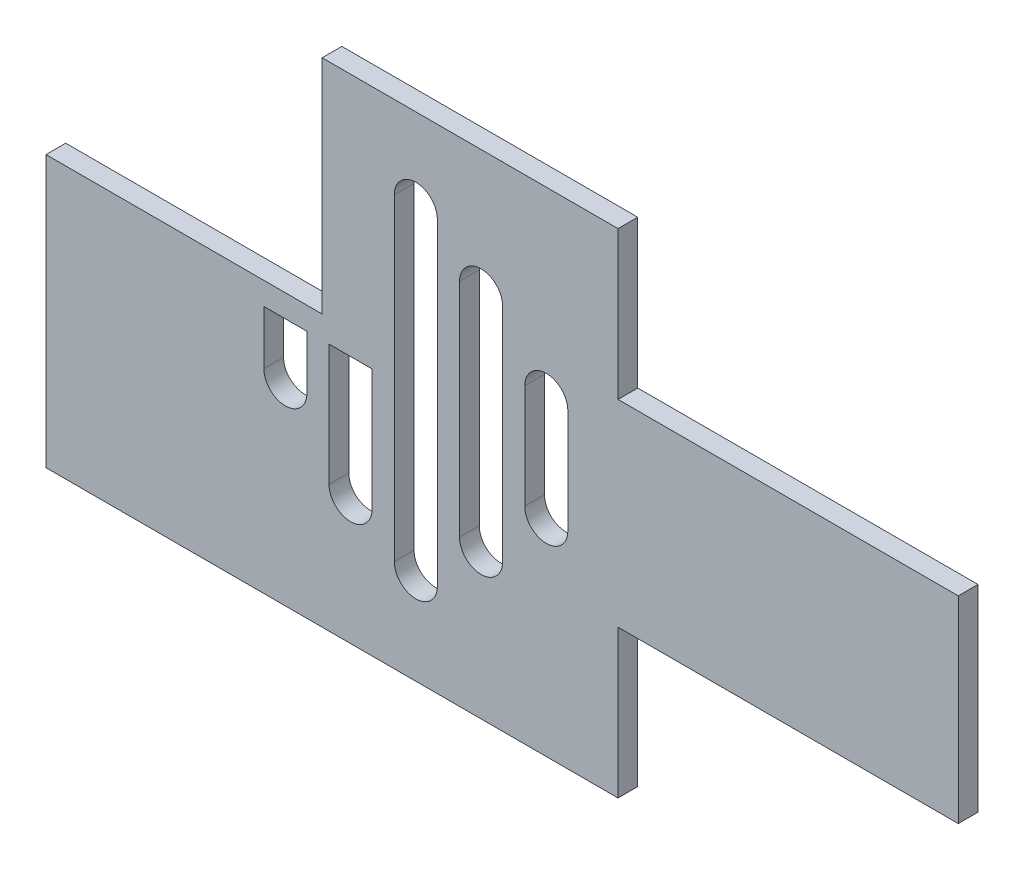
ISO-10303-21;
HEADER;
FILE_DESCRIPTION(('STEP AP214'),'2;1');
FILE_NAME('part.step','',(''),(''),'','','');
FILE_SCHEMA(('AUTOMOTIVE_DESIGN { 1 0 10303 214 1 1 1 1 }'));
ENDSEC;
DATA;
#1=APPLICATION_CONTEXT('core data for automotive mechanical design processes');
#2=APPLICATION_PROTOCOL_DEFINITION('international standard','automotive_design',2000,#1);
#3=PRODUCT_CONTEXT('',#1,'mechanical');
#4=PRODUCT('Part','Part','',(#3));
#5=PRODUCT_RELATED_PRODUCT_CATEGORY('part','',(#4));
#6=PRODUCT_DEFINITION_FORMATION('','',#4);
#7=PRODUCT_DEFINITION_CONTEXT('part definition',#1,'design');
#8=PRODUCT_DEFINITION('design','',#6,#7);
#9=PRODUCT_DEFINITION_SHAPE('','',#8);
#10=(LENGTH_UNIT() NAMED_UNIT(*) SI_UNIT(.MILLI.,.METRE.));
#11=(NAMED_UNIT(*) PLANE_ANGLE_UNIT() SI_UNIT($,.RADIAN.));
#12=(NAMED_UNIT(*) SI_UNIT($,.STERADIAN.) SOLID_ANGLE_UNIT());
#13=UNCERTAINTY_MEASURE_WITH_UNIT(LENGTH_MEASURE(1.E-05),#10,'distance_accuracy_value','');
#14=(GEOMETRIC_REPRESENTATION_CONTEXT(3) GLOBAL_UNCERTAINTY_ASSIGNED_CONTEXT((#13)) GLOBAL_UNIT_ASSIGNED_CONTEXT((#10,
#11,#12)) REPRESENTATION_CONTEXT('',''));
#15=CARTESIAN_POINT('',(0.,0.,0.));
#16=DIRECTION('',(0.,0.,1.));
#17=DIRECTION('',(1.,0.,0.));
#18=AXIS2_PLACEMENT_3D('',#15,#16,#17);
#19=CARTESIAN_POINT('',(0.,0.,4.));
#20=DIRECTION('',(0.,0.,1.));
#21=DIRECTION('',(1.,0.,0.));
#22=AXIS2_PLACEMENT_3D('',#19,#20,#21);
#23=PLANE('',#22);
#24=DIRECTION('',(1.,0.,0.));
#25=VECTOR('',#24,1.);
#26=CARTESIAN_POINT('',(41.,-50.,4.));
#27=LINE('',#26,#25);
#28=CARTESIAN_POINT('',(-75.,-50.,4.));
#29=VERTEX_POINT('',#28);
#30=CARTESIAN_POINT('',(41.,-50.,4.));
#31=VERTEX_POINT('',#30);
#32=EDGE_CURVE('E390',#29,#31,#27,.T.);
#33=ORIENTED_EDGE('',*,*,#32,.T.);
#34=DIRECTION('',(0.,1.,0.));
#35=VECTOR('',#34,1.);
#36=CARTESIAN_POINT('',(41.,-20.,4.));
#37=LINE('',#36,#35);
#38=CARTESIAN_POINT('',(41.,-20.,4.));
#39=VERTEX_POINT('',#38);
#40=EDGE_CURVE('E393',#31,#39,#37,.T.);
#41=ORIENTED_EDGE('',*,*,#40,.T.);
#42=DIRECTION('',(1.,0.,0.));
#43=VECTOR('',#42,1.);
#44=CARTESIAN_POINT('',(110.,-20.,4.));
#45=LINE('',#44,#43);
#46=CARTESIAN_POINT('',(110.,-20.,4.));
#47=VERTEX_POINT('',#46);
#48=EDGE_CURVE('E396',#39,#47,#45,.T.);
#49=ORIENTED_EDGE('',*,*,#48,.T.);
#50=DIRECTION('',(0.,1.,0.));
#51=VECTOR('',#50,1.);
#52=CARTESIAN_POINT('',(110.,20.,4.));
#53=LINE('',#52,#51);
#54=CARTESIAN_POINT('',(110.,20.,4.));
#55=VERTEX_POINT('',#54);
#56=EDGE_CURVE('E398',#47,#55,#53,.T.);
#57=ORIENTED_EDGE('',*,*,#56,.T.);
#58=DIRECTION('',(-1.,0.,0.));
#59=VECTOR('',#58,1.);
#60=CARTESIAN_POINT('',(41.,20.,4.));
#61=LINE('',#60,#59);
#62=CARTESIAN_POINT('',(41.,20.,4.));
#63=VERTEX_POINT('',#62);
#64=EDGE_CURVE('E400',#55,#63,#61,.T.);
#65=ORIENTED_EDGE('',*,*,#64,.T.);
#66=DIRECTION('',(0.,1.,0.));
#67=VECTOR('',#66,1.);
#68=CARTESIAN_POINT('',(41.,50.,4.));
#69=LINE('',#68,#67);
#70=CARTESIAN_POINT('',(41.,50.,4.));
#71=VERTEX_POINT('',#70);
#72=EDGE_CURVE('E402',#63,#71,#69,.T.);
#73=ORIENTED_EDGE('',*,*,#72,.T.);
#74=DIRECTION('',(-1.,0.,0.));
#75=VECTOR('',#74,1.);
#76=CARTESIAN_POINT('',(41.,50.,4.));
#77=LINE('',#76,#75);
#78=CARTESIAN_POINT('',(-19.,50.,4.));
#79=VERTEX_POINT('',#78);
#80=EDGE_CURVE('E404',#71,#79,#77,.T.);
#81=ORIENTED_EDGE('',*,*,#80,.T.);
#82=DIRECTION('',(0.,-1.,0.));
#83=VECTOR('',#82,1.);
#84=CARTESIAN_POINT('',(-19.,50.,4.));
#85=LINE('',#84,#83);
#86=CARTESIAN_POINT('',(-19.,4.99999999999997,4.));
#87=VERTEX_POINT('',#86);
#88=EDGE_CURVE('E406',#79,#87,#85,.T.);
#89=ORIENTED_EDGE('',*,*,#88,.T.);
#90=DIRECTION('',(-1.,0.,0.));
#91=VECTOR('',#90,1.);
#92=CARTESIAN_POINT('',(-19.,4.99999999999997,4.));
#93=LINE('',#92,#91);
#94=CARTESIAN_POINT('',(-75.,4.99999999999998,4.));
#95=VERTEX_POINT('',#94);
#96=EDGE_CURVE('E408',#87,#95,#93,.T.);
#97=ORIENTED_EDGE('',*,*,#96,.T.);
#98=DIRECTION('',(0.,-1.,0.));
#99=VECTOR('',#98,1.);
#100=CARTESIAN_POINT('',(-75.,4.99999999999998,4.));
#101=LINE('',#100,#99);
#102=EDGE_CURVE('E410',#95,#29,#101,.T.);
#103=ORIENTED_EDGE('',*,*,#102,.T.);
#104=EDGE_LOOP('',(#33,#41,#49,#57,#65,#73,#81,#89,#97,#103));
#105=FACE_BOUND('',#104,.T.);
#106=DIRECTION('',(0.,-1.,0.));
#107=VECTOR('',#106,1.);
#108=CARTESIAN_POINT('',(-4.36484114330157,33.2683363309352,4.));
#109=LINE('',#108,#107);
#110=CARTESIAN_POINT('',(-4.36484114330157,33.2683363309352,4.));
#111=VERTEX_POINT('',#110);
#112=CARTESIAN_POINT('',(-4.36484114330157,-31.1611600719424,4.));
#113=VERTEX_POINT('',#112);
#114=EDGE_CURVE('E361',#111,#113,#109,.T.);
#115=ORIENTED_EDGE('',*,*,#114,.F.);
#116=CARTESIAN_POINT('',(0.,33.2683363309352,4.));
#117=DIRECTION('',(0.,0.,1.));
#118=DIRECTION('',(1.,0.,0.));
#119=AXIS2_PLACEMENT_3D('',#116,#117,#118);
#120=CIRCLE('',#119,4.36484114330157);
#121=CARTESIAN_POINT('',(4.36484114330157,33.2683363309352,4.));
#122=VERTEX_POINT('',#121);
#123=EDGE_CURVE('E359',#122,#111,#120,.T.);
#124=ORIENTED_EDGE('',*,*,#123,.F.);
#125=DIRECTION('',(0.,1.,0.));
#126=VECTOR('',#125,1.);
#127=CARTESIAN_POINT('',(4.36484114330157,33.2683363309352,4.));
#128=LINE('',#127,#126);
#129=CARTESIAN_POINT('',(4.36484114330157,-31.1611600719424,4.));
#130=VERTEX_POINT('',#129);
#131=EDGE_CURVE('E367',#130,#122,#128,.T.);
#132=ORIENTED_EDGE('',*,*,#131,.F.);
#133=CARTESIAN_POINT('',(0.,-31.1611600719424,4.));
#134=DIRECTION('',(0.,0.,1.));
#135=DIRECTION('',(1.,0.,0.));
#136=AXIS2_PLACEMENT_3D('',#133,#134,#135);
#137=CIRCLE('',#136,4.36484114330157);
#138=EDGE_CURVE('E364',#113,#130,#137,.T.);
#139=ORIENTED_EDGE('',*,*,#138,.F.);
#140=EDGE_LOOP('',(#115,#124,#132,#139));
#141=FACE_BOUND('',#140,.T.);
#142=DIRECTION('',(0.,-1.,0.));
#143=VECTOR('',#142,1.);
#144=CARTESIAN_POINT('',(8.86484114330157,24.6777368105516,4.));
#145=LINE('',#144,#143);
#146=CARTESIAN_POINT('',(8.86484114330157,24.6777368105516,4.));
#147=VERTEX_POINT('',#146);
#148=CARTESIAN_POINT('',(8.86484114330157,-20.2577068345324,4.));
#149=VERTEX_POINT('',#148);
#150=EDGE_CURVE('E330',#147,#149,#145,.T.);
#151=ORIENTED_EDGE('',*,*,#150,.F.);
#152=CARTESIAN_POINT('',(13.2296822833016,24.6777368105516,4.));
#153=DIRECTION('',(0.,0.,1.));
#154=DIRECTION('',(1.,0.,0.));
#155=AXIS2_PLACEMENT_3D('',#152,#153,#154);
#156=CIRCLE('',#155,4.36484114);
#157=CARTESIAN_POINT('',(17.5945234233016,24.6777368105516,4.));
#158=VERTEX_POINT('',#157);
#159=EDGE_CURVE('E328',#158,#147,#156,.T.);
#160=ORIENTED_EDGE('',*,*,#159,.F.);
#161=DIRECTION('',(0.,1.,0.));
#162=VECTOR('',#161,1.);
#163=CARTESIAN_POINT('',(17.5945234233016,24.6777368105516,4.));
#164=LINE('',#163,#162);
#165=CARTESIAN_POINT('',(17.5945234233016,-20.2577068345324,4.));
#166=VERTEX_POINT('',#165);
#167=EDGE_CURVE('E336',#166,#158,#164,.T.);
#168=ORIENTED_EDGE('',*,*,#167,.F.);
#169=CARTESIAN_POINT('',(13.2296822833016,-20.2577068345324,4.));
#170=DIRECTION('',(0.,0.,1.));
#171=DIRECTION('',(1.,0.,0.));
#172=AXIS2_PLACEMENT_3D('',#169,#170,#171);
#173=CIRCLE('',#172,4.36484114);
#174=EDGE_CURVE('E333',#149,#166,#173,.T.);
#175=ORIENTED_EDGE('',*,*,#174,.F.);
#176=EDGE_LOOP('',(#151,#160,#168,#175));
#177=FACE_BOUND('',#176,.T.);
#178=DIRECTION('',(0.,-1.,0.));
#179=VECTOR('',#178,1.);
#180=CARTESIAN_POINT('',(22.0945234233016,12.9482643884892,4.));
#181=LINE('',#180,#179);
#182=CARTESIAN_POINT('',(22.0945234233016,12.9482643884892,4.));
#183=VERTEX_POINT('',#182);
#184=CARTESIAN_POINT('',(22.0945234233016,-8.19782673860911,4.));
#185=VERTEX_POINT('',#184);
#186=EDGE_CURVE('E299',#183,#185,#181,.T.);
#187=ORIENTED_EDGE('',*,*,#186,.F.);
#188=CARTESIAN_POINT('',(26.4593645633016,12.9482643884892,4.));
#189=DIRECTION('',(0.,0.,1.));
#190=DIRECTION('',(1.,0.,0.));
#191=AXIS2_PLACEMENT_3D('',#188,#189,#190);
#192=CIRCLE('',#191,4.36484114);
#193=CARTESIAN_POINT('',(30.8242057033016,12.9482643884892,4.));
#194=VERTEX_POINT('',#193);
#195=EDGE_CURVE('E297',#194,#183,#192,.T.);
#196=ORIENTED_EDGE('',*,*,#195,.F.);
#197=DIRECTION('',(0.,1.,0.));
#198=VECTOR('',#197,1.);
#199=CARTESIAN_POINT('',(30.8242057033016,12.9482643884892,4.));
#200=LINE('',#199,#198);
#201=CARTESIAN_POINT('',(30.8242057033016,-8.19782673860911,4.));
#202=VERTEX_POINT('',#201);
#203=EDGE_CURVE('E305',#202,#194,#200,.T.);
#204=ORIENTED_EDGE('',*,*,#203,.F.);
#205=CARTESIAN_POINT('',(26.4593645633016,-8.19782673860911,4.));
#206=DIRECTION('',(0.,0.,1.));
#207=DIRECTION('',(1.,0.,0.));
#208=AXIS2_PLACEMENT_3D('',#205,#206,#207);
#209=CIRCLE('',#208,4.36484114);
#210=EDGE_CURVE('E302',#185,#202,#209,.T.);
#211=ORIENTED_EDGE('',*,*,#210,.F.);
#212=EDGE_LOOP('',(#187,#196,#204,#211));
#213=FACE_BOUND('',#212,.T.);
#214=CARTESIAN_POINT('',(-26.4593645633016,-10.5106804556355,4.));
#215=DIRECTION('',(0.,0.,1.));
#216=DIRECTION('',(1.,0.,0.));
#217=AXIS2_PLACEMENT_3D('',#214,#215,#216);
#218=CIRCLE('',#217,4.36484114);
#219=CARTESIAN_POINT('',(-30.8242057033016,-10.5106804556355,4.));
#220=VERTEX_POINT('',#219);
#221=CARTESIAN_POINT('',(-22.0945234233016,-10.5106804556355,4.));
#222=VERTEX_POINT('',#221);
#223=EDGE_CURVE('E268',#220,#222,#218,.T.);
#224=ORIENTED_EDGE('',*,*,#223,.F.);
#225=DIRECTION('',(0.,-1.,0.));
#226=VECTOR('',#225,1.);
#227=CARTESIAN_POINT('',(-30.8242057033016,0.416133701783561,4.));
#228=LINE('',#227,#226);
#229=CARTESIAN_POINT('',(-30.8242057033016,0.416133701783561,4.));
#230=VERTEX_POINT('',#229);
#231=EDGE_CURVE('E266',#230,#220,#228,.T.);
#232=ORIENTED_EDGE('',*,*,#231,.F.);
#233=DIRECTION('',(-1.,0.,0.));
#234=VECTOR('',#233,1.);
#235=CARTESIAN_POINT('',(-30.8242057033016,0.416133701783561,4.));
#236=LINE('',#235,#234);
#237=CARTESIAN_POINT('',(-22.0945234233016,0.416133701783561,4.));
#238=VERTEX_POINT('',#237);
#239=EDGE_CURVE('E274',#238,#230,#236,.T.);
#240=ORIENTED_EDGE('',*,*,#239,.F.);
#241=DIRECTION('',(0.,1.,0.));
#242=VECTOR('',#241,1.);
#243=CARTESIAN_POINT('',(-22.0945234233016,-10.5106804556355,4.));
#244=LINE('',#243,#242);
#245=EDGE_CURVE('E271',#222,#238,#244,.T.);
#246=ORIENTED_EDGE('',*,*,#245,.F.);
#247=EDGE_LOOP('',(#224,#232,#240,#246));
#248=FACE_BOUND('',#247,.T.);
#249=CARTESIAN_POINT('',(-13.2296822833016,-24.2225989208633,4.));
#250=DIRECTION('',(0.,0.,1.));
#251=DIRECTION('',(1.,0.,0.));
#252=AXIS2_PLACEMENT_3D('',#249,#250,#251);
#253=CIRCLE('',#252,4.36484114);
#254=CARTESIAN_POINT('',(-17.5945234233016,-24.2225989208633,4.));
#255=VERTEX_POINT('',#254);
#256=CARTESIAN_POINT('',(-8.86484114330157,-24.2225989208633,4.));
#257=VERTEX_POINT('',#256);
#258=EDGE_CURVE('E238',#255,#257,#253,.T.);
#259=ORIENTED_EDGE('',*,*,#258,.F.);
#260=DIRECTION('',(0.,-1.,0.));
#261=VECTOR('',#260,1.);
#262=CARTESIAN_POINT('',(-17.5945234233016,-24.2225989208633,4.));
#263=LINE('',#262,#261);
#264=CARTESIAN_POINT('',(-17.5945234233016,0.416133701783561,4.));
#265=VERTEX_POINT('',#264);
#266=EDGE_CURVE('E230',#265,#255,#263,.T.);
#267=ORIENTED_EDGE('',*,*,#266,.F.);
#268=DIRECTION('',(-1.,0.,0.));
#269=VECTOR('',#268,1.);
#270=CARTESIAN_POINT('',(-17.5945234233016,0.416133701783561,4.));
#271=LINE('',#270,#269);
#272=CARTESIAN_POINT('',(-8.86484114330158,0.416133701783561,4.));
#273=VERTEX_POINT('',#272);
#274=EDGE_CURVE('E252',#273,#265,#271,.T.);
#275=ORIENTED_EDGE('',*,*,#274,.F.);
#276=DIRECTION('',(0.,1.,0.));
#277=VECTOR('',#276,1.);
#278=CARTESIAN_POINT('',(-8.86484114330158,0.416133701783561,4.));
#279=LINE('',#278,#277);
#280=EDGE_CURVE('E250',#257,#273,#279,.T.);
#281=ORIENTED_EDGE('',*,*,#280,.F.);
#282=EDGE_LOOP('',(#259,#267,#275,#281));
#283=FACE_BOUND('',#282,.T.);
#284=ADVANCED_FACE('F33',(#105,#141,#177,#213,#248,#283),#23,.T.);
#285=CARTESIAN_POINT('',(0.,0.,0.));
#286=DIRECTION('',(0.,0.,1.));
#287=DIRECTION('',(1.,0.,0.));
#288=AXIS2_PLACEMENT_3D('',#285,#286,#287);
#289=PLANE('',#288);
#290=DIRECTION('',(0.,-1.,0.));
#291=VECTOR('',#290,1.);
#292=CARTESIAN_POINT('',(-30.8242057033016,0.416133701783561,0.));
#293=LINE('',#292,#291);
#294=CARTESIAN_POINT('',(-30.8242057033016,0.416133701783561,0.));
#295=VERTEX_POINT('',#294);
#296=CARTESIAN_POINT('',(-30.8242057033016,-10.5106804556355,0.));
#297=VERTEX_POINT('',#296);
#298=EDGE_CURVE('E246',#295,#297,#293,.T.);
#299=ORIENTED_EDGE('',*,*,#298,.T.);
#300=CARTESIAN_POINT('',(-26.4593645633016,-10.5106804556355,0.));
#301=DIRECTION('',(0.,0.,1.));
#302=DIRECTION('',(1.,0.,0.));
#303=AXIS2_PLACEMENT_3D('',#300,#301,#302);
#304=CIRCLE('',#303,4.36484114);
#305=CARTESIAN_POINT('',(-22.0945234233016,-10.5106804556355,0.));
#306=VERTEX_POINT('',#305);
#307=EDGE_CURVE('E279',#297,#306,#304,.T.);
#308=ORIENTED_EDGE('',*,*,#307,.T.);
#309=DIRECTION('',(0.,1.,0.));
#310=VECTOR('',#309,1.);
#311=CARTESIAN_POINT('',(-22.0945234233016,-10.5106804556355,0.));
#312=LINE('',#311,#310);
#313=CARTESIAN_POINT('',(-22.0945234233016,0.416133701783561,0.));
#314=VERTEX_POINT('',#313);
#315=EDGE_CURVE('E282',#306,#314,#312,.T.);
#316=ORIENTED_EDGE('',*,*,#315,.T.);
#317=DIRECTION('',(-1.,0.,0.));
#318=VECTOR('',#317,1.);
#319=CARTESIAN_POINT('',(-30.8242057033016,0.416133701783561,0.));
#320=LINE('',#319,#318);
#321=EDGE_CURVE('E269',#314,#295,#320,.T.);
#322=ORIENTED_EDGE('',*,*,#321,.T.);
#323=EDGE_LOOP('',(#299,#308,#316,#322));
#324=FACE_BOUND('',#323,.T.);
#325=CARTESIAN_POINT('',(13.2296822833016,24.6777368105516,0.));
#326=DIRECTION('',(0.,0.,1.));
#327=DIRECTION('',(1.,0.,0.));
#328=AXIS2_PLACEMENT_3D('',#325,#326,#327);
#329=CIRCLE('',#328,4.36484114);
#330=CARTESIAN_POINT('',(17.5945234233016,24.6777368105516,0.));
#331=VERTEX_POINT('',#330);
#332=CARTESIAN_POINT('',(8.86484114330157,24.6777368105516,0.));
#333=VERTEX_POINT('',#332);
#334=EDGE_CURVE('E327',#331,#333,#329,.T.);
#335=ORIENTED_EDGE('',*,*,#334,.T.);
#336=DIRECTION('',(0.,-1.,0.));
#337=VECTOR('',#336,1.);
#338=CARTESIAN_POINT('',(8.86484114330157,24.6777368105516,0.));
#339=LINE('',#338,#337);
#340=CARTESIAN_POINT('',(8.86484114330157,-20.2577068345324,0.));
#341=VERTEX_POINT('',#340);
#342=EDGE_CURVE('E341',#333,#341,#339,.T.);
#343=ORIENTED_EDGE('',*,*,#342,.T.);
#344=CARTESIAN_POINT('',(13.2296822833016,-20.2577068345324,0.));
#345=DIRECTION('',(0.,0.,1.));
#346=DIRECTION('',(1.,0.,0.));
#347=AXIS2_PLACEMENT_3D('',#344,#345,#346);
#348=CIRCLE('',#347,4.36484114);
#349=CARTESIAN_POINT('',(17.5945234233016,-20.2577068345324,0.));
#350=VERTEX_POINT('',#349);
#351=EDGE_CURVE('E344',#341,#350,#348,.T.);
#352=ORIENTED_EDGE('',*,*,#351,.T.);
#353=DIRECTION('',(0.,1.,0.));
#354=VECTOR('',#353,1.);
#355=CARTESIAN_POINT('',(17.5945234233016,24.6777368105516,0.));
#356=LINE('',#355,#354);
#357=EDGE_CURVE('E331',#350,#331,#356,.T.);
#358=ORIENTED_EDGE('',*,*,#357,.T.);
#359=EDGE_LOOP('',(#335,#343,#352,#358));
#360=FACE_BOUND('',#359,.T.);
#361=DIRECTION('',(1.,0.,0.));
#362=VECTOR('',#361,1.);
#363=CARTESIAN_POINT('',(41.,-50.,0.));
#364=LINE('',#363,#362);
#365=CARTESIAN_POINT('',(-75.,-50.,0.));
#366=VERTEX_POINT('',#365);
#367=CARTESIAN_POINT('',(41.,-50.,0.));
#368=VERTEX_POINT('',#367);
#369=EDGE_CURVE('E389',#366,#368,#364,.T.);
#370=ORIENTED_EDGE('',*,*,#369,.F.);
#371=DIRECTION('',(0.,-1.,0.));
#372=VECTOR('',#371,1.);
#373=CARTESIAN_POINT('',(-75.,4.99999999999998,0.));
#374=LINE('',#373,#372);
#375=CARTESIAN_POINT('',(-75.,4.99999999999998,0.));
#376=VERTEX_POINT('',#375);
#377=EDGE_CURVE('E394',#376,#366,#374,.T.);
#378=ORIENTED_EDGE('',*,*,#377,.F.);
#379=DIRECTION('',(-1.,0.,0.));
#380=VECTOR('',#379,1.);
#381=CARTESIAN_POINT('',(-19.,4.99999999999997,0.));
#382=LINE('',#381,#380);
#383=CARTESIAN_POINT('',(-19.,4.99999999999997,0.));
#384=VERTEX_POINT('',#383);
#385=EDGE_CURVE('E429',#384,#376,#382,.T.);
#386=ORIENTED_EDGE('',*,*,#385,.F.);
#387=DIRECTION('',(0.,-1.,0.));
#388=VECTOR('',#387,1.);
#389=CARTESIAN_POINT('',(-19.,50.,0.));
#390=LINE('',#389,#388);
#391=CARTESIAN_POINT('',(-19.,50.,0.));
#392=VERTEX_POINT('',#391);
#393=EDGE_CURVE('E427',#392,#384,#390,.T.);
#394=ORIENTED_EDGE('',*,*,#393,.F.);
#395=DIRECTION('',(-1.,0.,0.));
#396=VECTOR('',#395,1.);
#397=CARTESIAN_POINT('',(41.,50.,0.));
#398=LINE('',#397,#396);
#399=CARTESIAN_POINT('',(41.,50.,0.));
#400=VERTEX_POINT('',#399);
#401=EDGE_CURVE('E425',#400,#392,#398,.T.);
#402=ORIENTED_EDGE('',*,*,#401,.F.);
#403=DIRECTION('',(0.,1.,0.));
#404=VECTOR('',#403,1.);
#405=CARTESIAN_POINT('',(41.,50.,0.));
#406=LINE('',#405,#404);
#407=CARTESIAN_POINT('',(41.,20.,0.));
#408=VERTEX_POINT('',#407);
#409=EDGE_CURVE('E423',#408,#400,#406,.T.);
#410=ORIENTED_EDGE('',*,*,#409,.F.);
#411=DIRECTION('',(-1.,0.,0.));
#412=VECTOR('',#411,1.);
#413=CARTESIAN_POINT('',(41.,20.,0.));
#414=LINE('',#413,#412);
#415=CARTESIAN_POINT('',(110.,20.,0.));
#416=VERTEX_POINT('',#415);
#417=EDGE_CURVE('E421',#416,#408,#414,.T.);
#418=ORIENTED_EDGE('',*,*,#417,.F.);
#419=DIRECTION('',(0.,1.,0.));
#420=VECTOR('',#419,1.);
#421=CARTESIAN_POINT('',(110.,20.,0.));
#422=LINE('',#421,#420);
#423=CARTESIAN_POINT('',(110.,-20.,0.));
#424=VERTEX_POINT('',#423);
#425=EDGE_CURVE('E419',#424,#416,#422,.T.);
#426=ORIENTED_EDGE('',*,*,#425,.F.);
#427=DIRECTION('',(1.,0.,0.));
#428=VECTOR('',#427,1.);
#429=CARTESIAN_POINT('',(110.,-20.,0.));
#430=LINE('',#429,#428);
#431=CARTESIAN_POINT('',(41.,-20.,0.));
#432=VERTEX_POINT('',#431);
#433=EDGE_CURVE('E417',#432,#424,#430,.T.);
#434=ORIENTED_EDGE('',*,*,#433,.F.);
#435=DIRECTION('',(0.,1.,0.));
#436=VECTOR('',#435,1.);
#437=CARTESIAN_POINT('',(41.,-20.,0.));
#438=LINE('',#437,#436);
#439=EDGE_CURVE('E415',#368,#432,#438,.T.);
#440=ORIENTED_EDGE('',*,*,#439,.F.);
#441=EDGE_LOOP('',(#370,#378,#386,#394,#402,#410,#418,#426,#434,#440));
#442=FACE_BOUND('',#441,.T.);
#443=CARTESIAN_POINT('',(0.,33.2683363309352,0.));
#444=DIRECTION('',(0.,0.,1.));
#445=DIRECTION('',(1.,0.,0.));
#446=AXIS2_PLACEMENT_3D('',#443,#444,#445);
#447=CIRCLE('',#446,4.36484114330157);
#448=CARTESIAN_POINT('',(4.36484114330157,33.2683363309352,0.));
#449=VERTEX_POINT('',#448);
#450=CARTESIAN_POINT('',(-4.36484114330157,33.2683363309352,0.));
#451=VERTEX_POINT('',#450);
#452=EDGE_CURVE('E358',#449,#451,#447,.T.);
#453=ORIENTED_EDGE('',*,*,#452,.T.);
#454=DIRECTION('',(0.,-1.,0.));
#455=VECTOR('',#454,1.);
#456=CARTESIAN_POINT('',(-4.36484114330157,33.2683363309352,0.));
#457=LINE('',#456,#455);
#458=CARTESIAN_POINT('',(-4.36484114330157,-31.1611600719424,0.));
#459=VERTEX_POINT('',#458);
#460=EDGE_CURVE('E372',#451,#459,#457,.T.);
#461=ORIENTED_EDGE('',*,*,#460,.T.);
#462=CARTESIAN_POINT('',(0.,-31.1611600719424,0.));
#463=DIRECTION('',(0.,0.,1.));
#464=DIRECTION('',(1.,0.,0.));
#465=AXIS2_PLACEMENT_3D('',#462,#463,#464);
#466=CIRCLE('',#465,4.36484114330157);
#467=CARTESIAN_POINT('',(4.36484114330157,-31.1611600719424,0.));
#468=VERTEX_POINT('',#467);
#469=EDGE_CURVE('E375',#459,#468,#466,.T.);
#470=ORIENTED_EDGE('',*,*,#469,.T.);
#471=DIRECTION('',(0.,1.,0.));
#472=VECTOR('',#471,1.);
#473=CARTESIAN_POINT('',(4.36484114330157,33.2683363309352,0.));
#474=LINE('',#473,#472);
#475=EDGE_CURVE('E362',#468,#449,#474,.T.);
#476=ORIENTED_EDGE('',*,*,#475,.T.);
#477=EDGE_LOOP('',(#453,#461,#470,#476));
#478=FACE_BOUND('',#477,.T.);
#479=CARTESIAN_POINT('',(26.4593645633016,12.9482643884892,0.));
#480=DIRECTION('',(0.,0.,1.));
#481=DIRECTION('',(1.,0.,0.));
#482=AXIS2_PLACEMENT_3D('',#479,#480,#481);
#483=CIRCLE('',#482,4.36484114);
#484=CARTESIAN_POINT('',(30.8242057033016,12.9482643884892,0.));
#485=VERTEX_POINT('',#484);
#486=CARTESIAN_POINT('',(22.0945234233016,12.9482643884892,0.));
#487=VERTEX_POINT('',#486);
#488=EDGE_CURVE('E296',#485,#487,#483,.T.);
#489=ORIENTED_EDGE('',*,*,#488,.T.);
#490=DIRECTION('',(0.,-1.,0.));
#491=VECTOR('',#490,1.);
#492=CARTESIAN_POINT('',(22.0945234233016,12.9482643884892,0.));
#493=LINE('',#492,#491);
#494=CARTESIAN_POINT('',(22.0945234233016,-8.19782673860911,0.));
#495=VERTEX_POINT('',#494);
#496=EDGE_CURVE('E310',#487,#495,#493,.T.);
#497=ORIENTED_EDGE('',*,*,#496,.T.);
#498=CARTESIAN_POINT('',(26.4593645633016,-8.19782673860911,0.));
#499=DIRECTION('',(0.,0.,1.));
#500=DIRECTION('',(1.,0.,0.));
#501=AXIS2_PLACEMENT_3D('',#498,#499,#500);
#502=CIRCLE('',#501,4.36484114);
#503=CARTESIAN_POINT('',(30.8242057033016,-8.19782673860911,0.));
#504=VERTEX_POINT('',#503);
#505=EDGE_CURVE('E313',#495,#504,#502,.T.);
#506=ORIENTED_EDGE('',*,*,#505,.T.);
#507=DIRECTION('',(0.,1.,0.));
#508=VECTOR('',#507,1.);
#509=CARTESIAN_POINT('',(30.8242057033016,12.9482643884892,0.));
#510=LINE('',#509,#508);
#511=EDGE_CURVE('E300',#504,#485,#510,.T.);
#512=ORIENTED_EDGE('',*,*,#511,.T.);
#513=EDGE_LOOP('',(#489,#497,#506,#512));
#514=FACE_BOUND('',#513,.T.);
#515=DIRECTION('',(0.,-1.,0.));
#516=VECTOR('',#515,1.);
#517=CARTESIAN_POINT('',(-17.5945234233016,-24.2225989208633,0.));
#518=LINE('',#517,#516);
#519=CARTESIAN_POINT('',(-17.5945234233016,0.416133701783561,0.));
#520=VERTEX_POINT('',#519);
#521=CARTESIAN_POINT('',(-17.5945234233016,-24.2225989208633,0.));
#522=VERTEX_POINT('',#521);
#523=EDGE_CURVE('E56',#520,#522,#518,.T.);
#524=ORIENTED_EDGE('',*,*,#523,.T.);
#525=CARTESIAN_POINT('',(-13.2296822833016,-24.2225989208633,0.));
#526=DIRECTION('',(0.,0.,1.));
#527=DIRECTION('',(1.,0.,0.));
#528=AXIS2_PLACEMENT_3D('',#525,#526,#527);
#529=CIRCLE('',#528,4.36484114);
#530=CARTESIAN_POINT('',(-8.86484114330157,-24.2225989208633,0.));
#531=VERTEX_POINT('',#530);
#532=EDGE_CURVE('E245',#522,#531,#529,.T.);
#533=ORIENTED_EDGE('',*,*,#532,.T.);
#534=DIRECTION('',(0.,1.,0.));
#535=VECTOR('',#534,1.);
#536=CARTESIAN_POINT('',(-8.86484114330158,0.416133701783561,0.));
#537=LINE('',#536,#535);
#538=CARTESIAN_POINT('',(-8.86484114330158,0.416133701783561,0.));
#539=VERTEX_POINT('',#538);
#540=EDGE_CURVE('E258',#531,#539,#537,.T.);
#541=ORIENTED_EDGE('',*,*,#540,.T.);
#542=DIRECTION('',(-1.,0.,0.));
#543=VECTOR('',#542,1.);
#544=CARTESIAN_POINT('',(-17.5945234233016,0.416133701783561,0.));
#545=LINE('',#544,#543);
#546=EDGE_CURVE('E239',#539,#520,#545,.T.);
#547=ORIENTED_EDGE('',*,*,#546,.T.);
#548=EDGE_LOOP('',(#524,#533,#541,#547));
#549=FACE_BOUND('',#548,.T.);
#550=ADVANCED_FACE('F465',(#324,#360,#442,#478,#514,#549),#289,.F.);
#551=CARTESIAN_POINT('',(41.,-50.,4.));
#552=DIRECTION('',(0.,1.,0.));
#553=DIRECTION('',(-1.,0.,0.));
#554=AXIS2_PLACEMENT_3D('',#551,#552,#553);
#555=PLANE('',#554);
#556=ORIENTED_EDGE('',*,*,#369,.T.);
#557=DIRECTION('',(0.,0.,-1.));
#558=VECTOR('',#557,1.);
#559=CARTESIAN_POINT('',(41.,-50.,4.));
#560=LINE('',#559,#558);
#561=EDGE_CURVE('E11',#31,#368,#560,.T.);
#562=ORIENTED_EDGE('',*,*,#561,.F.);
#563=ORIENTED_EDGE('',*,*,#32,.F.);
#564=DIRECTION('',(0.,0.,-1.));
#565=VECTOR('',#564,1.);
#566=CARTESIAN_POINT('',(-75.,-50.,4.));
#567=LINE('',#566,#565);
#568=EDGE_CURVE('E412',#29,#366,#567,.T.);
#569=ORIENTED_EDGE('',*,*,#568,.T.);
#570=EDGE_LOOP('',(#556,#562,#563,#569));
#571=FACE_BOUND('',#570,.T.);
#572=ADVANCED_FACE('F35',(#571),#555,.F.);
#573=CARTESIAN_POINT('',(41.,-20.,4.));
#574=DIRECTION('',(-1.,0.,0.));
#575=DIRECTION('',(0.,-1.,0.));
#576=AXIS2_PLACEMENT_3D('',#573,#574,#575);
#577=PLANE('',#576);
#578=ORIENTED_EDGE('',*,*,#439,.T.);
#579=DIRECTION('',(0.,0.,-1.));
#580=VECTOR('',#579,1.);
#581=CARTESIAN_POINT('',(41.,-20.,4.));
#582=LINE('',#581,#580);
#583=EDGE_CURVE('E41',#39,#432,#582,.T.);
#584=ORIENTED_EDGE('',*,*,#583,.F.);
#585=ORIENTED_EDGE('',*,*,#40,.F.);
#586=ORIENTED_EDGE('',*,*,#561,.T.);
#587=EDGE_LOOP('',(#578,#584,#585,#586));
#588=FACE_BOUND('',#587,.T.);
#589=ADVANCED_FACE('F483',(#588),#577,.F.);
#590=CARTESIAN_POINT('',(110.,-20.,4.));
#591=DIRECTION('',(0.,1.,0.));
#592=DIRECTION('',(-1.,0.,0.));
#593=AXIS2_PLACEMENT_3D('',#590,#591,#592);
#594=PLANE('',#593);
#595=ORIENTED_EDGE('',*,*,#433,.T.);
#596=DIRECTION('',(0.,0.,-1.));
#597=VECTOR('',#596,1.);
#598=CARTESIAN_POINT('',(110.,-20.,4.));
#599=LINE('',#598,#597);
#600=EDGE_CURVE('E452',#47,#424,#599,.T.);
#601=ORIENTED_EDGE('',*,*,#600,.F.);
#602=ORIENTED_EDGE('',*,*,#48,.F.);
#603=ORIENTED_EDGE('',*,*,#583,.T.);
#604=EDGE_LOOP('',(#595,#601,#602,#603));
#605=FACE_BOUND('',#604,.T.);
#606=ADVANCED_FACE('F459',(#605),#594,.F.);
#607=CARTESIAN_POINT('',(110.,20.,4.));
#608=DIRECTION('',(-1.,0.,0.));
#609=DIRECTION('',(0.,-1.,0.));
#610=AXIS2_PLACEMENT_3D('',#607,#608,#609);
#611=PLANE('',#610);
#612=ORIENTED_EDGE('',*,*,#425,.T.);
#613=DIRECTION('',(0.,0.,-1.));
#614=VECTOR('',#613,1.);
#615=CARTESIAN_POINT('',(110.,20.,4.));
#616=LINE('',#615,#614);
#617=EDGE_CURVE('E449',#55,#416,#616,.T.);
#618=ORIENTED_EDGE('',*,*,#617,.F.);
#619=ORIENTED_EDGE('',*,*,#56,.F.);
#620=ORIENTED_EDGE('',*,*,#600,.T.);
#621=EDGE_LOOP('',(#612,#618,#619,#620));
#622=FACE_BOUND('',#621,.T.);
#623=ADVANCED_FACE('F471',(#622),#611,.F.);
#624=CARTESIAN_POINT('',(41.,20.,4.));
#625=DIRECTION('',(0.,-1.,0.));
#626=DIRECTION('',(0.,0.,-1.));
#627=AXIS2_PLACEMENT_3D('',#624,#625,#626);
#628=PLANE('',#627);
#629=ORIENTED_EDGE('',*,*,#417,.T.);
#630=DIRECTION('',(0.,0.,-1.));
#631=VECTOR('',#630,1.);
#632=CARTESIAN_POINT('',(41.,20.,4.));
#633=LINE('',#632,#631);
#634=EDGE_CURVE('E446',#63,#408,#633,.T.);
#635=ORIENTED_EDGE('',*,*,#634,.F.);
#636=ORIENTED_EDGE('',*,*,#64,.F.);
#637=ORIENTED_EDGE('',*,*,#617,.T.);
#638=EDGE_LOOP('',(#629,#635,#636,#637));
#639=FACE_BOUND('',#638,.T.);
#640=ADVANCED_FACE('F475',(#639),#628,.F.);
#641=CARTESIAN_POINT('',(41.,50.,4.));
#642=DIRECTION('',(-1.,0.,0.));
#643=DIRECTION('',(0.,-1.,0.));
#644=AXIS2_PLACEMENT_3D('',#641,#642,#643);
#645=PLANE('',#644);
#646=ORIENTED_EDGE('',*,*,#409,.T.);
#647=DIRECTION('',(0.,0.,-1.));
#648=VECTOR('',#647,1.);
#649=CARTESIAN_POINT('',(41.,50.,4.));
#650=LINE('',#649,#648);
#651=EDGE_CURVE('E443',#71,#400,#650,.T.);
#652=ORIENTED_EDGE('',*,*,#651,.F.);
#653=ORIENTED_EDGE('',*,*,#72,.F.);
#654=ORIENTED_EDGE('',*,*,#634,.T.);
#655=EDGE_LOOP('',(#646,#652,#653,#654));
#656=FACE_BOUND('',#655,.T.);
#657=ADVANCED_FACE('F506',(#656),#645,.F.);
#658=CARTESIAN_POINT('',(41.,50.,4.));
#659=DIRECTION('',(0.,-1.,0.));
#660=DIRECTION('',(1.,0.,0.));
#661=AXIS2_PLACEMENT_3D('',#658,#659,#660);
#662=PLANE('',#661);
#663=ORIENTED_EDGE('',*,*,#401,.T.);
#664=DIRECTION('',(0.,0.,-1.));
#665=VECTOR('',#664,1.);
#666=CARTESIAN_POINT('',(-19.,50.,4.));
#667=LINE('',#666,#665);
#668=EDGE_CURVE('E440',#79,#392,#667,.T.);
#669=ORIENTED_EDGE('',*,*,#668,.F.);
#670=ORIENTED_EDGE('',*,*,#80,.F.);
#671=ORIENTED_EDGE('',*,*,#651,.T.);
#672=EDGE_LOOP('',(#663,#669,#670,#671));
#673=FACE_BOUND('',#672,.T.);
#674=ADVANCED_FACE('F503',(#673),#662,.F.);
#675=CARTESIAN_POINT('',(-19.,50.,4.));
#676=DIRECTION('',(1.,0.,0.));
#677=DIRECTION('',(0.,1.,0.));
#678=AXIS2_PLACEMENT_3D('',#675,#676,#677);
#679=PLANE('',#678);
#680=ORIENTED_EDGE('',*,*,#393,.T.);
#681=DIRECTION('',(0.,0.,-1.));
#682=VECTOR('',#681,1.);
#683=CARTESIAN_POINT('',(-19.,4.99999999999997,4.));
#684=LINE('',#683,#682);
#685=EDGE_CURVE('E437',#87,#384,#684,.T.);
#686=ORIENTED_EDGE('',*,*,#685,.F.);
#687=ORIENTED_EDGE('',*,*,#88,.F.);
#688=ORIENTED_EDGE('',*,*,#668,.T.);
#689=EDGE_LOOP('',(#680,#686,#687,#688));
#690=FACE_BOUND('',#689,.T.);
#691=ADVANCED_FACE('F499',(#690),#679,.F.);
#692=CARTESIAN_POINT('',(-19.,4.99999999999997,4.));
#693=DIRECTION('',(0.,-1.,0.));
#694=DIRECTION('',(1.,0.,0.));
#695=AXIS2_PLACEMENT_3D('',#692,#693,#694);
#696=PLANE('',#695);
#697=ORIENTED_EDGE('',*,*,#385,.T.);
#698=DIRECTION('',(0.,0.,-1.));
#699=VECTOR('',#698,1.);
#700=CARTESIAN_POINT('',(-75.,4.99999999999998,4.));
#701=LINE('',#700,#699);
#702=EDGE_CURVE('E434',#95,#376,#701,.T.);
#703=ORIENTED_EDGE('',*,*,#702,.F.);
#704=ORIENTED_EDGE('',*,*,#96,.F.);
#705=ORIENTED_EDGE('',*,*,#685,.T.);
#706=EDGE_LOOP('',(#697,#703,#704,#705));
#707=FACE_BOUND('',#706,.T.);
#708=ADVANCED_FACE('F495',(#707),#696,.F.);
#709=CARTESIAN_POINT('',(-75.,4.99999999999998,4.));
#710=DIRECTION('',(1.,0.,0.));
#711=DIRECTION('',(0.,1.,0.));
#712=AXIS2_PLACEMENT_3D('',#709,#710,#711);
#713=PLANE('',#712);
#714=ORIENTED_EDGE('',*,*,#377,.T.);
#715=ORIENTED_EDGE('',*,*,#568,.F.);
#716=ORIENTED_EDGE('',*,*,#102,.F.);
#717=ORIENTED_EDGE('',*,*,#702,.T.);
#718=EDGE_LOOP('',(#714,#715,#716,#717));
#719=FACE_BOUND('',#718,.T.);
#720=ADVANCED_FACE('F490',(#719),#713,.F.);
#721=CARTESIAN_POINT('',(0.,33.2683363309352,4.));
#722=DIRECTION('',(0.,0.,-1.));
#723=DIRECTION('',(-1.,0.,0.));
#724=AXIS2_PLACEMENT_3D('',#721,#722,#723);
#725=CYLINDRICAL_SURFACE('',#724,4.36484114330157);
#726=ORIENTED_EDGE('',*,*,#452,.F.);
#727=DIRECTION('',(0.,0.,-1.));
#728=VECTOR('',#727,1.);
#729=CARTESIAN_POINT('',(4.36484114330157,33.2683363309352,4.));
#730=LINE('',#729,#728);
#731=EDGE_CURVE('E369',#122,#449,#730,.T.);
#732=ORIENTED_EDGE('',*,*,#731,.F.);
#733=ORIENTED_EDGE('',*,*,#123,.T.);
#734=DIRECTION('',(0.,0.,-1.));
#735=VECTOR('',#734,1.);
#736=CARTESIAN_POINT('',(-4.36484114330157,33.2683363309352,4.));
#737=LINE('',#736,#735);
#738=EDGE_CURVE('E386',#111,#451,#737,.T.);
#739=ORIENTED_EDGE('',*,*,#738,.T.);
#740=EDGE_LOOP('',(#726,#732,#733,#739));
#741=FACE_BOUND('',#740,.T.);
#742=ADVANCED_FACE('F523',(#741),#725,.F.);
#743=CARTESIAN_POINT('',(-4.36484114330157,33.2683363309352,4.));
#744=DIRECTION('',(1.,0.,0.));
#745=DIRECTION('',(0.,0.,-1.));
#746=AXIS2_PLACEMENT_3D('',#743,#744,#745);
#747=PLANE('',#746);
#748=ORIENTED_EDGE('',*,*,#460,.F.);
#749=ORIENTED_EDGE('',*,*,#738,.F.);
#750=ORIENTED_EDGE('',*,*,#114,.T.);
#751=DIRECTION('',(0.,0.,-1.));
#752=VECTOR('',#751,1.);
#753=CARTESIAN_POINT('',(-4.36484114330157,-31.1611600719424,4.));
#754=LINE('',#753,#752);
#755=EDGE_CURVE('E384',#113,#459,#754,.T.);
#756=ORIENTED_EDGE('',*,*,#755,.T.);
#757=EDGE_LOOP('',(#748,#749,#750,#756));
#758=FACE_BOUND('',#757,.T.);
#759=ADVANCED_FACE('F549',(#758),#747,.T.);
#760=CARTESIAN_POINT('',(0.,-31.1611600719424,4.));
#761=DIRECTION('',(0.,0.,-1.));
#762=DIRECTION('',(-1.,0.,0.));
#763=AXIS2_PLACEMENT_3D('',#760,#761,#762);
#764=CYLINDRICAL_SURFACE('',#763,4.36484114330157);
#765=ORIENTED_EDGE('',*,*,#469,.F.);
#766=ORIENTED_EDGE('',*,*,#755,.F.);
#767=ORIENTED_EDGE('',*,*,#138,.T.);
#768=DIRECTION('',(0.,0.,-1.));
#769=VECTOR('',#768,1.);
#770=CARTESIAN_POINT('',(4.36484114330157,-31.1611600719424,4.));
#771=LINE('',#770,#769);
#772=EDGE_CURVE('E382',#130,#468,#771,.T.);
#773=ORIENTED_EDGE('',*,*,#772,.T.);
#774=EDGE_LOOP('',(#765,#766,#767,#773));
#775=FACE_BOUND('',#774,.T.);
#776=ADVANCED_FACE('F556',(#775),#764,.F.);
#777=CARTESIAN_POINT('',(4.36484114330157,33.2683363309352,4.));
#778=DIRECTION('',(-1.,0.,0.));
#779=DIRECTION('',(0.,0.,1.));
#780=AXIS2_PLACEMENT_3D('',#777,#778,#779);
#781=PLANE('',#780);
#782=ORIENTED_EDGE('',*,*,#475,.F.);
#783=ORIENTED_EDGE('',*,*,#772,.F.);
#784=ORIENTED_EDGE('',*,*,#131,.T.);
#785=ORIENTED_EDGE('',*,*,#731,.T.);
#786=EDGE_LOOP('',(#782,#783,#784,#785));
#787=FACE_BOUND('',#786,.T.);
#788=ADVANCED_FACE('F563',(#787),#781,.T.);
#789=CARTESIAN_POINT('',(13.2296822833016,24.6777368105516,4.));
#790=DIRECTION('',(0.,0.,-1.));
#791=DIRECTION('',(-1.,0.,0.));
#792=AXIS2_PLACEMENT_3D('',#789,#790,#791);
#793=CYLINDRICAL_SURFACE('',#792,4.36484114);
#794=ORIENTED_EDGE('',*,*,#334,.F.);
#795=DIRECTION('',(0.,0.,-1.));
#796=VECTOR('',#795,1.);
#797=CARTESIAN_POINT('',(17.5945234233016,24.6777368105516,4.));
#798=LINE('',#797,#796);
#799=EDGE_CURVE('E338',#158,#331,#798,.T.);
#800=ORIENTED_EDGE('',*,*,#799,.F.);
#801=ORIENTED_EDGE('',*,*,#159,.T.);
#802=DIRECTION('',(0.,0.,-1.));
#803=VECTOR('',#802,1.);
#804=CARTESIAN_POINT('',(8.86484114330157,24.6777368105516,4.));
#805=LINE('',#804,#803);
#806=EDGE_CURVE('E355',#147,#333,#805,.T.);
#807=ORIENTED_EDGE('',*,*,#806,.T.);
#808=EDGE_LOOP('',(#794,#800,#801,#807));
#809=FACE_BOUND('',#808,.T.);
#810=ADVANCED_FACE('F571',(#809),#793,.F.);
#811=CARTESIAN_POINT('',(8.86484114330157,24.6777368105516,4.));
#812=DIRECTION('',(1.,0.,0.));
#813=DIRECTION('',(0.,0.,-1.));
#814=AXIS2_PLACEMENT_3D('',#811,#812,#813);
#815=PLANE('',#814);
#816=ORIENTED_EDGE('',*,*,#342,.F.);
#817=ORIENTED_EDGE('',*,*,#806,.F.);
#818=ORIENTED_EDGE('',*,*,#150,.T.);
#819=DIRECTION('',(0.,0.,-1.));
#820=VECTOR('',#819,1.);
#821=CARTESIAN_POINT('',(8.86484114330157,-20.2577068345324,4.));
#822=LINE('',#821,#820);
#823=EDGE_CURVE('E353',#149,#341,#822,.T.);
#824=ORIENTED_EDGE('',*,*,#823,.T.);
#825=EDGE_LOOP('',(#816,#817,#818,#824));
#826=FACE_BOUND('',#825,.T.);
#827=ADVANCED_FACE('F579',(#826),#815,.T.);
#828=CARTESIAN_POINT('',(13.2296822833016,-20.2577068345324,4.));
#829=DIRECTION('',(0.,0.,-1.));
#830=DIRECTION('',(-1.,0.,0.));
#831=AXIS2_PLACEMENT_3D('',#828,#829,#830);
#832=CYLINDRICAL_SURFACE('',#831,4.36484114);
#833=ORIENTED_EDGE('',*,*,#351,.F.);
#834=ORIENTED_EDGE('',*,*,#823,.F.);
#835=ORIENTED_EDGE('',*,*,#174,.T.);
#836=DIRECTION('',(0.,0.,-1.));
#837=VECTOR('',#836,1.);
#838=CARTESIAN_POINT('',(17.5945234233016,-20.2577068345324,4.));
#839=LINE('',#838,#837);
#840=EDGE_CURVE('E351',#166,#350,#839,.T.);
#841=ORIENTED_EDGE('',*,*,#840,.T.);
#842=EDGE_LOOP('',(#833,#834,#835,#841));
#843=FACE_BOUND('',#842,.T.);
#844=ADVANCED_FACE('F587',(#843),#832,.F.);
#845=CARTESIAN_POINT('',(17.5945234233016,24.6777368105516,4.));
#846=DIRECTION('',(-1.,0.,0.));
#847=DIRECTION('',(0.,-1.,0.));
#848=AXIS2_PLACEMENT_3D('',#845,#846,#847);
#849=PLANE('',#848);
#850=ORIENTED_EDGE('',*,*,#357,.F.);
#851=ORIENTED_EDGE('',*,*,#840,.F.);
#852=ORIENTED_EDGE('',*,*,#167,.T.);
#853=ORIENTED_EDGE('',*,*,#799,.T.);
#854=EDGE_LOOP('',(#850,#851,#852,#853));
#855=FACE_BOUND('',#854,.T.);
#856=ADVANCED_FACE('F595',(#855),#849,.T.);
#857=CARTESIAN_POINT('',(26.4593645633016,12.9482643884892,4.));
#858=DIRECTION('',(0.,0.,-1.));
#859=DIRECTION('',(-1.,0.,0.));
#860=AXIS2_PLACEMENT_3D('',#857,#858,#859);
#861=CYLINDRICAL_SURFACE('',#860,4.36484114);
#862=ORIENTED_EDGE('',*,*,#488,.F.);
#863=DIRECTION('',(0.,0.,-1.));
#864=VECTOR('',#863,1.);
#865=CARTESIAN_POINT('',(30.8242057033016,12.9482643884892,4.));
#866=LINE('',#865,#864);
#867=EDGE_CURVE('E307',#194,#485,#866,.T.);
#868=ORIENTED_EDGE('',*,*,#867,.F.);
#869=ORIENTED_EDGE('',*,*,#195,.T.);
#870=DIRECTION('',(0.,0.,-1.));
#871=VECTOR('',#870,1.);
#872=CARTESIAN_POINT('',(22.0945234233016,12.9482643884892,4.));
#873=LINE('',#872,#871);
#874=EDGE_CURVE('E324',#183,#487,#873,.T.);
#875=ORIENTED_EDGE('',*,*,#874,.T.);
#876=EDGE_LOOP('',(#862,#868,#869,#875));
#877=FACE_BOUND('',#876,.T.);
#878=ADVANCED_FACE('F603',(#877),#861,.F.);
#879=CARTESIAN_POINT('',(22.0945234233016,12.9482643884892,4.));
#880=DIRECTION('',(1.,0.,0.));
#881=DIRECTION('',(0.,0.,-1.));
#882=AXIS2_PLACEMENT_3D('',#879,#880,#881);
#883=PLANE('',#882);
#884=ORIENTED_EDGE('',*,*,#496,.F.);
#885=ORIENTED_EDGE('',*,*,#874,.F.);
#886=ORIENTED_EDGE('',*,*,#186,.T.);
#887=DIRECTION('',(0.,0.,-1.));
#888=VECTOR('',#887,1.);
#889=CARTESIAN_POINT('',(22.0945234233016,-8.19782673860911,4.));
#890=LINE('',#889,#888);
#891=EDGE_CURVE('E322',#185,#495,#890,.T.);
#892=ORIENTED_EDGE('',*,*,#891,.T.);
#893=EDGE_LOOP('',(#884,#885,#886,#892));
#894=FACE_BOUND('',#893,.T.);
#895=ADVANCED_FACE('F611',(#894),#883,.T.);
#896=CARTESIAN_POINT('',(26.4593645633016,-8.19782673860911,4.));
#897=DIRECTION('',(0.,0.,-1.));
#898=DIRECTION('',(-1.,0.,0.));
#899=AXIS2_PLACEMENT_3D('',#896,#897,#898);
#900=CYLINDRICAL_SURFACE('',#899,4.36484114);
#901=ORIENTED_EDGE('',*,*,#505,.F.);
#902=ORIENTED_EDGE('',*,*,#891,.F.);
#903=ORIENTED_EDGE('',*,*,#210,.T.);
#904=DIRECTION('',(0.,0.,-1.));
#905=VECTOR('',#904,1.);
#906=CARTESIAN_POINT('',(30.8242057033016,-8.19782673860911,4.));
#907=LINE('',#906,#905);
#908=EDGE_CURVE('E320',#202,#504,#907,.T.);
#909=ORIENTED_EDGE('',*,*,#908,.T.);
#910=EDGE_LOOP('',(#901,#902,#903,#909));
#911=FACE_BOUND('',#910,.T.);
#912=ADVANCED_FACE('F619',(#911),#900,.F.);
#913=CARTESIAN_POINT('',(30.8242057033016,12.9482643884892,4.));
#914=DIRECTION('',(-1.,0.,0.));
#915=DIRECTION('',(0.,-1.,0.));
#916=AXIS2_PLACEMENT_3D('',#913,#914,#915);
#917=PLANE('',#916);
#918=ORIENTED_EDGE('',*,*,#511,.F.);
#919=ORIENTED_EDGE('',*,*,#908,.F.);
#920=ORIENTED_EDGE('',*,*,#203,.T.);
#921=ORIENTED_EDGE('',*,*,#867,.T.);
#922=EDGE_LOOP('',(#918,#919,#920,#921));
#923=FACE_BOUND('',#922,.T.);
#924=ADVANCED_FACE('F627',(#923),#917,.T.);
#925=CARTESIAN_POINT('',(-30.8242057033016,0.416133701783561,4.));
#926=DIRECTION('',(1.,0.,0.));
#927=DIRECTION('',(0.,1.,0.));
#928=AXIS2_PLACEMENT_3D('',#925,#926,#927);
#929=PLANE('',#928);
#930=ORIENTED_EDGE('',*,*,#298,.F.);
#931=DIRECTION('',(0.,0.,-1.));
#932=VECTOR('',#931,1.);
#933=CARTESIAN_POINT('',(-30.8242057033016,0.416133701783561,4.));
#934=LINE('',#933,#932);
#935=EDGE_CURVE('E276',#230,#295,#934,.T.);
#936=ORIENTED_EDGE('',*,*,#935,.F.);
#937=ORIENTED_EDGE('',*,*,#231,.T.);
#938=DIRECTION('',(0.,0.,-1.));
#939=VECTOR('',#938,1.);
#940=CARTESIAN_POINT('',(-30.8242057033016,-10.5106804556355,4.));
#941=LINE('',#940,#939);
#942=EDGE_CURVE('E293',#220,#297,#941,.T.);
#943=ORIENTED_EDGE('',*,*,#942,.T.);
#944=EDGE_LOOP('',(#930,#936,#937,#943));
#945=FACE_BOUND('',#944,.T.);
#946=ADVANCED_FACE('F635',(#945),#929,.T.);
#947=CARTESIAN_POINT('',(-26.4593645633016,-10.5106804556355,4.));
#948=DIRECTION('',(0.,0.,-1.));
#949=DIRECTION('',(-1.,0.,0.));
#950=AXIS2_PLACEMENT_3D('',#947,#948,#949);
#951=CYLINDRICAL_SURFACE('',#950,4.36484114);
#952=ORIENTED_EDGE('',*,*,#307,.F.);
#953=ORIENTED_EDGE('',*,*,#942,.F.);
#954=ORIENTED_EDGE('',*,*,#223,.T.);
#955=DIRECTION('',(0.,0.,-1.));
#956=VECTOR('',#955,1.);
#957=CARTESIAN_POINT('',(-22.0945234233016,-10.5106804556355,4.));
#958=LINE('',#957,#956);
#959=EDGE_CURVE('E291',#222,#306,#958,.T.);
#960=ORIENTED_EDGE('',*,*,#959,.T.);
#961=EDGE_LOOP('',(#952,#953,#954,#960));
#962=FACE_BOUND('',#961,.T.);
#963=ADVANCED_FACE('F643',(#962),#951,.F.);
#964=CARTESIAN_POINT('',(-22.0945234233016,-10.5106804556355,4.));
#965=DIRECTION('',(-1.,0.,0.));
#966=DIRECTION('',(0.,0.,1.));
#967=AXIS2_PLACEMENT_3D('',#964,#965,#966);
#968=PLANE('',#967);
#969=ORIENTED_EDGE('',*,*,#315,.F.);
#970=ORIENTED_EDGE('',*,*,#959,.F.);
#971=ORIENTED_EDGE('',*,*,#245,.T.);
#972=DIRECTION('',(0.,0.,-1.));
#973=VECTOR('',#972,1.);
#974=CARTESIAN_POINT('',(-22.0945234233016,0.416133701783561,4.));
#975=LINE('',#974,#973);
#976=EDGE_CURVE('E289',#238,#314,#975,.T.);
#977=ORIENTED_EDGE('',*,*,#976,.T.);
#978=EDGE_LOOP('',(#969,#970,#971,#977));
#979=FACE_BOUND('',#978,.T.);
#980=ADVANCED_FACE('F651',(#979),#968,.T.);
#981=CARTESIAN_POINT('',(-30.8242057033016,0.416133701783561,4.));
#982=DIRECTION('',(0.,-1.,0.));
#983=DIRECTION('',(0.,0.,-1.));
#984=AXIS2_PLACEMENT_3D('',#981,#982,#983);
#985=PLANE('',#984);
#986=ORIENTED_EDGE('',*,*,#321,.F.);
#987=ORIENTED_EDGE('',*,*,#976,.F.);
#988=ORIENTED_EDGE('',*,*,#239,.T.);
#989=ORIENTED_EDGE('',*,*,#935,.T.);
#990=EDGE_LOOP('',(#986,#987,#988,#989));
#991=FACE_BOUND('',#990,.T.);
#992=ADVANCED_FACE('F659',(#991),#985,.T.);
#993=CARTESIAN_POINT('',(-17.5945234233016,-24.2225989208633,4.));
#994=DIRECTION('',(1.,0.,0.));
#995=DIRECTION('',(0.,0.,-1.));
#996=AXIS2_PLACEMENT_3D('',#993,#994,#995);
#997=PLANE('',#996);
#998=ORIENTED_EDGE('',*,*,#523,.F.);
#999=DIRECTION('',(0.,0.,-1.));
#1000=VECTOR('',#999,1.);
#1001=CARTESIAN_POINT('',(-17.5945234233016,0.416133701783561,4.));
#1002=LINE('',#1001,#1000);
#1003=EDGE_CURVE('E234',#265,#520,#1002,.T.);
#1004=ORIENTED_EDGE('',*,*,#1003,.F.);
#1005=ORIENTED_EDGE('',*,*,#266,.T.);
#1006=DIRECTION('',(0.,0.,-1.));
#1007=VECTOR('',#1006,1.);
#1008=CARTESIAN_POINT('',(-17.5945234233016,-24.2225989208633,4.));
#1009=LINE('',#1008,#1007);
#1010=EDGE_CURVE('E233',#255,#522,#1009,.T.);
#1011=ORIENTED_EDGE('',*,*,#1010,.T.);
#1012=EDGE_LOOP('',(#998,#1004,#1005,#1011));
#1013=FACE_BOUND('',#1012,.T.);
#1014=ADVANCED_FACE('F232',(#1013),#997,.T.);
#1015=CARTESIAN_POINT('',(-13.2296822833016,-24.2225989208633,4.));
#1016=DIRECTION('',(0.,0.,-1.));
#1017=DIRECTION('',(-1.,0.,0.));
#1018=AXIS2_PLACEMENT_3D('',#1015,#1016,#1017);
#1019=CYLINDRICAL_SURFACE('',#1018,4.36484114);
#1020=ORIENTED_EDGE('',*,*,#532,.F.);
#1021=ORIENTED_EDGE('',*,*,#1010,.F.);
#1022=ORIENTED_EDGE('',*,*,#258,.T.);
#1023=DIRECTION('',(0.,0.,-1.));
#1024=VECTOR('',#1023,1.);
#1025=CARTESIAN_POINT('',(-8.86484114330157,-24.2225989208633,4.));
#1026=LINE('',#1025,#1024);
#1027=EDGE_CURVE('E247',#257,#531,#1026,.T.);
#1028=ORIENTED_EDGE('',*,*,#1027,.T.);
#1029=EDGE_LOOP('',(#1020,#1021,#1022,#1028));
#1030=FACE_BOUND('',#1029,.T.);
#1031=ADVANCED_FACE('F242',(#1030),#1019,.F.);
#1032=CARTESIAN_POINT('',(-8.86484114330158,0.416133701783561,4.));
#1033=DIRECTION('',(-1.,0.,0.));
#1034=DIRECTION('',(0.,-1.,0.));
#1035=AXIS2_PLACEMENT_3D('',#1032,#1033,#1034);
#1036=PLANE('',#1035);
#1037=ORIENTED_EDGE('',*,*,#540,.F.);
#1038=ORIENTED_EDGE('',*,*,#1027,.F.);
#1039=ORIENTED_EDGE('',*,*,#280,.T.);
#1040=DIRECTION('',(0.,0.,-1.));
#1041=VECTOR('',#1040,1.);
#1042=CARTESIAN_POINT('',(-8.86484114330158,0.416133701783561,4.));
#1043=LINE('',#1042,#1041);
#1044=EDGE_CURVE('E48',#273,#539,#1043,.T.);
#1045=ORIENTED_EDGE('',*,*,#1044,.T.);
#1046=EDGE_LOOP('',(#1037,#1038,#1039,#1045));
#1047=FACE_BOUND('',#1046,.T.);
#1048=ADVANCED_FACE('F680',(#1047),#1036,.T.);
#1049=CARTESIAN_POINT('',(-17.5945234233016,0.416133701783561,4.));
#1050=DIRECTION('',(0.,-1.,0.));
#1051=DIRECTION('',(0.,0.,-1.));
#1052=AXIS2_PLACEMENT_3D('',#1049,#1050,#1051);
#1053=PLANE('',#1052);
#1054=ORIENTED_EDGE('',*,*,#546,.F.);
#1055=ORIENTED_EDGE('',*,*,#1044,.F.);
#1056=ORIENTED_EDGE('',*,*,#274,.T.);
#1057=ORIENTED_EDGE('',*,*,#1003,.T.);
#1058=EDGE_LOOP('',(#1054,#1055,#1056,#1057));
#1059=FACE_BOUND('',#1058,.T.);
#1060=ADVANCED_FACE('F687',(#1059),#1053,.T.);
#1061=CLOSED_SHELL('',(#284,#550,#572,#589,#606,#623,#640,#657,#674,#691,#708,#720,#742,#759,
#776,#788,#810,#827,#844,#856,#878,#895,#912,#924,#946,#963,#980,#992,#1014,#1031,#1048,#1060));
#1062=MANIFOLD_SOLID_BREP('B2',#1061);
#1063=ADVANCED_BREP_SHAPE_REPRESENTATION('',(#18,#1062),#14);
#1064=SHAPE_DEFINITION_REPRESENTATION(#9,#1063);
ENDSEC;
END-ISO-10303-21;
